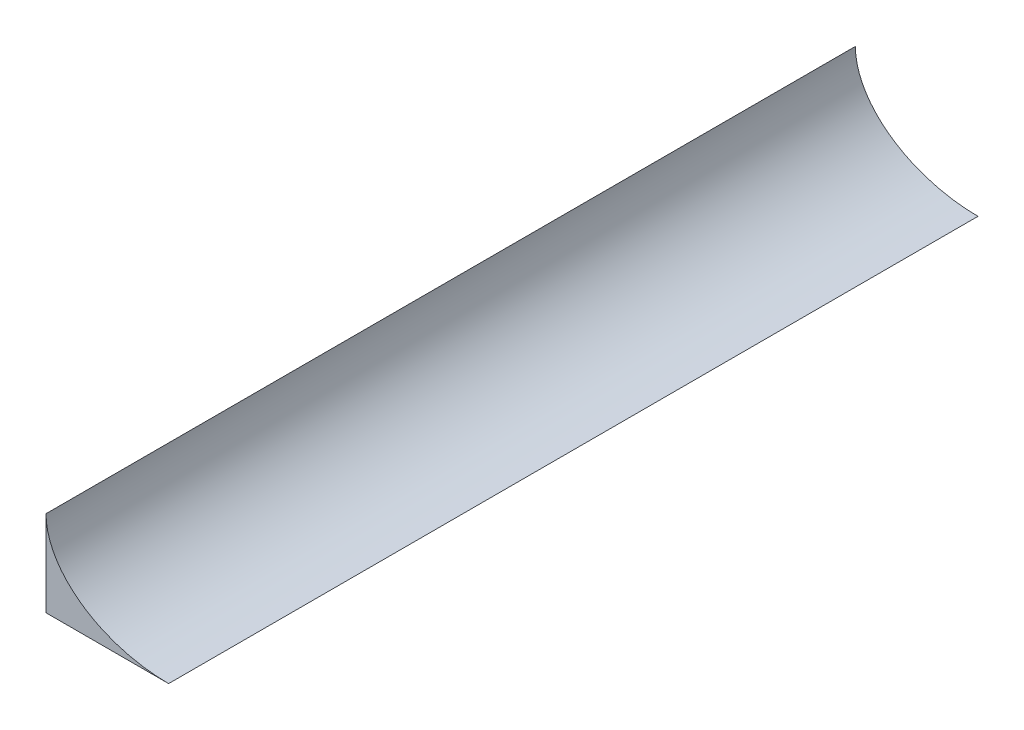
ISO-10303-21;
HEADER;
FILE_DESCRIPTION(('STEP AP214'),'2;1');
FILE_NAME('part.step','',(''),(''),'','','');
FILE_SCHEMA(('AUTOMOTIVE_DESIGN { 1 0 10303 214 1 1 1 1 }'));
ENDSEC;
DATA;
#1=APPLICATION_CONTEXT('core data for automotive mechanical design processes');
#2=APPLICATION_PROTOCOL_DEFINITION('international standard','automotive_design',2000,#1);
#3=PRODUCT_CONTEXT('',#1,'mechanical');
#4=PRODUCT('Part','Part','',(#3));
#5=PRODUCT_RELATED_PRODUCT_CATEGORY('part','',(#4));
#6=PRODUCT_DEFINITION_FORMATION('','',#4);
#7=PRODUCT_DEFINITION_CONTEXT('part definition',#1,'design');
#8=PRODUCT_DEFINITION('design','',#6,#7);
#9=PRODUCT_DEFINITION_SHAPE('','',#8);
#10=(LENGTH_UNIT() NAMED_UNIT(*) SI_UNIT(.MILLI.,.METRE.));
#11=(NAMED_UNIT(*) PLANE_ANGLE_UNIT() SI_UNIT($,.RADIAN.));
#12=(NAMED_UNIT(*) SI_UNIT($,.STERADIAN.) SOLID_ANGLE_UNIT());
#13=UNCERTAINTY_MEASURE_WITH_UNIT(LENGTH_MEASURE(1.E-05),#10,'distance_accuracy_value','');
#14=(GEOMETRIC_REPRESENTATION_CONTEXT(3) GLOBAL_UNCERTAINTY_ASSIGNED_CONTEXT((#13)) GLOBAL_UNIT_ASSIGNED_CONTEXT((#10,
#11,#12)) REPRESENTATION_CONTEXT('',''));
#15=CARTESIAN_POINT('',(0.,0.,0.));
#16=DIRECTION('',(0.,0.,1.));
#17=DIRECTION('',(1.,0.,0.));
#18=AXIS2_PLACEMENT_3D('',#15,#16,#17);
#19=CARTESIAN_POINT('',(0.,7.,0.));
#20=DIRECTION('',(1.,0.,0.));
#21=DIRECTION('',(0.,0.,-1.));
#22=AXIS2_PLACEMENT_3D('',#19,#20,#21);
#23=PLANE('',#22);
#24=DIRECTION('',(0.,0.,1.));
#25=VECTOR('',#24,1.);
#26=CARTESIAN_POINT('',(0.,0.,0.));
#27=LINE('',#26,#25);
#28=CARTESIAN_POINT('',(0.,0.,-66.));
#29=VERTEX_POINT('',#28);
#30=CARTESIAN_POINT('',(0.,0.,0.));
#31=VERTEX_POINT('',#30);
#32=EDGE_CURVE('E74',#29,#31,#27,.T.);
#33=ORIENTED_EDGE('',*,*,#32,.T.);
#34=DIRECTION('',(0.,-1.,0.));
#35=VECTOR('',#34,1.);
#36=CARTESIAN_POINT('',(0.,7.,0.));
#37=LINE('',#36,#35);
#38=CARTESIAN_POINT('',(0.,7.,0.));
#39=VERTEX_POINT('',#38);
#40=EDGE_CURVE('E11',#39,#31,#37,.T.);
#41=ORIENTED_EDGE('',*,*,#40,.F.);
#42=DIRECTION('',(0.,0.,1.));
#43=VECTOR('',#42,1.);
#44=CARTESIAN_POINT('',(0.,7.,0.));
#45=LINE('',#44,#43);
#46=CARTESIAN_POINT('',(0.,7.,-66.));
#47=VERTEX_POINT('',#46);
#48=EDGE_CURVE('E71',#47,#39,#45,.T.);
#49=ORIENTED_EDGE('',*,*,#48,.F.);
#50=DIRECTION('',(0.,-1.,0.));
#51=VECTOR('',#50,1.);
#52=CARTESIAN_POINT('',(0.,7.,-66.));
#53=LINE('',#52,#51);
#54=EDGE_CURVE('E42',#47,#29,#53,.T.);
#55=ORIENTED_EDGE('',*,*,#54,.T.);
#56=EDGE_LOOP('',(#33,#41,#49,#55));
#57=FACE_BOUND('',#56,.T.);
#58=ADVANCED_FACE('F35',(#57),#23,.F.);
#59=CARTESIAN_POINT('',(0.,7.,0.));
#60=DIRECTION('',(0.,0.,-1.));
#61=DIRECTION('',(-1.,0.,0.));
#62=AXIS2_PLACEMENT_3D('',#59,#60,#61);
#63=PLANE('',#62);
#64=DIRECTION('',(1.,0.,0.));
#65=VECTOR('',#64,1.);
#66=CARTESIAN_POINT('',(0.,0.,0.));
#67=LINE('',#66,#65);
#68=CARTESIAN_POINT('',(10.,0.,0.));
#69=VERTEX_POINT('',#68);
#70=EDGE_CURVE('E86',#31,#69,#67,.T.);
#71=ORIENTED_EDGE('',*,*,#70,.T.);
#72=CARTESIAN_POINT('',(10.,7.,0.));
#73=DIRECTION('',(0.,0.,1.));
#74=DIRECTION('',(-1.,0.,0.));
#75=AXIS2_PLACEMENT_3D('',#72,#73,#74);
#76=ELLIPSE('',#75,10.,7.);
#77=EDGE_CURVE('E57',#39,#69,#76,.T.);
#78=ORIENTED_EDGE('',*,*,#77,.F.);
#79=ORIENTED_EDGE('',*,*,#40,.T.);
#80=EDGE_LOOP('',(#71,#78,#79));
#81=FACE_BOUND('',#80,.T.);
#82=ADVANCED_FACE('F89',(#81),#63,.F.);
#83=CARTESIAN_POINT('',(0.,7.,-66.));
#84=DIRECTION('',(0.,0.,1.));
#85=DIRECTION('',(1.,0.,0.));
#86=AXIS2_PLACEMENT_3D('',#83,#84,#85);
#87=PLANE('',#86);
#88=ORIENTED_EDGE('',*,*,#54,.F.);
#89=CARTESIAN_POINT('',(10.,7.,-66.));
#90=DIRECTION('',(0.,0.,1.));
#91=DIRECTION('',(-1.,0.,0.));
#92=AXIS2_PLACEMENT_3D('',#89,#90,#91);
#93=ELLIPSE('',#92,10.,7.);
#94=CARTESIAN_POINT('',(10.,0.,-66.));
#95=VERTEX_POINT('',#94);
#96=EDGE_CURVE('E68',#47,#95,#93,.T.);
#97=ORIENTED_EDGE('',*,*,#96,.T.);
#98=DIRECTION('',(-1.,0.,0.));
#99=VECTOR('',#98,1.);
#100=CARTESIAN_POINT('',(0.,0.,-66.));
#101=LINE('',#100,#99);
#102=EDGE_CURVE('E49',#95,#29,#101,.T.);
#103=ORIENTED_EDGE('',*,*,#102,.T.);
#104=EDGE_LOOP('',(#88,#97,#103));
#105=FACE_BOUND('',#104,.T.);
#106=ADVANCED_FACE('F76',(#105),#87,.F.);
#107=CARTESIAN_POINT('',(0.,0.,0.));
#108=DIRECTION('',(0.,-1.,0.));
#109=DIRECTION('',(0.,0.,-1.));
#110=AXIS2_PLACEMENT_3D('',#107,#108,#109);
#111=PLANE('',#110);
#112=ORIENTED_EDGE('',*,*,#32,.F.);
#113=ORIENTED_EDGE('',*,*,#102,.F.);
#114=DIRECTION('',(0.,0.,-1.));
#115=VECTOR('',#114,1.);
#116=CARTESIAN_POINT('',(10.,0.,0.));
#117=LINE('',#116,#115);
#118=EDGE_CURVE('E73',#69,#95,#117,.T.);
#119=ORIENTED_EDGE('',*,*,#118,.F.);
#120=ORIENTED_EDGE('',*,*,#70,.F.);
#121=EDGE_LOOP('',(#112,#113,#119,#120));
#122=FACE_BOUND('',#121,.T.);
#123=ADVANCED_FACE('F91',(#122),#111,.T.);
#124=DIRECTION('',(0.,0.,1.));
#125=VECTOR('',#124,1.);
#126=SURFACE_OF_LINEAR_EXTRUSION('',#93,#125);
#127=ORIENTED_EDGE('',*,*,#77,.T.);
#128=ORIENTED_EDGE('',*,*,#118,.T.);
#129=ORIENTED_EDGE('',*,*,#96,.F.);
#130=ORIENTED_EDGE('',*,*,#48,.T.);
#131=EDGE_LOOP('',(#127,#128,#129,#130));
#132=FACE_BOUND('',#131,.T.);
#133=ADVANCED_FACE('F69',(#132),#126,.F.);
#134=CLOSED_SHELL('',(#58,#82,#106,#123,#133));
#135=MANIFOLD_SOLID_BREP('B2',#134);
#136=ADVANCED_BREP_SHAPE_REPRESENTATION('',(#18,#135),#14);
#137=SHAPE_DEFINITION_REPRESENTATION(#9,#136);
ENDSEC;
END-ISO-10303-21;
